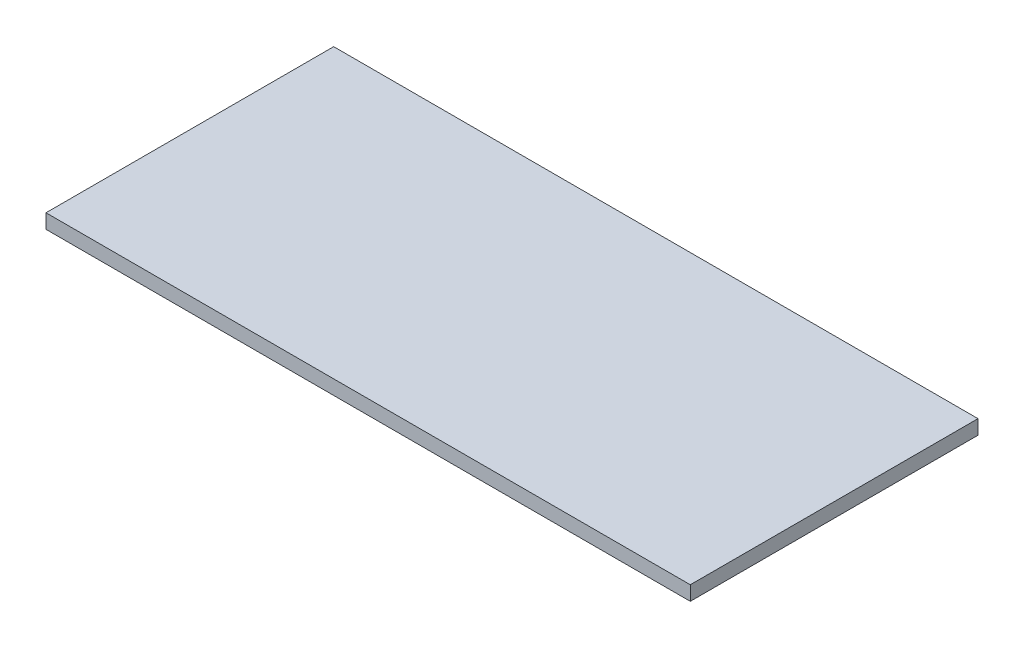
ISO-10303-21;
HEADER;
FILE_DESCRIPTION(('STEP AP214'),'2;1');
FILE_NAME('part.step','',(''),(''),'','','');
FILE_SCHEMA(('AUTOMOTIVE_DESIGN { 1 0 10303 214 1 1 1 1 }'));
ENDSEC;
DATA;
#1=APPLICATION_CONTEXT('core data for automotive mechanical design processes');
#2=APPLICATION_PROTOCOL_DEFINITION('international standard','automotive_design',2000,#1);
#3=PRODUCT_CONTEXT('',#1,'mechanical');
#4=PRODUCT('Part','Part','',(#3));
#5=PRODUCT_RELATED_PRODUCT_CATEGORY('part','',(#4));
#6=PRODUCT_DEFINITION_FORMATION('','',#4);
#7=PRODUCT_DEFINITION_CONTEXT('part definition',#1,'design');
#8=PRODUCT_DEFINITION('design','',#6,#7);
#9=PRODUCT_DEFINITION_SHAPE('','',#8);
#10=(LENGTH_UNIT() NAMED_UNIT(*) SI_UNIT(.MILLI.,.METRE.));
#11=(NAMED_UNIT(*) PLANE_ANGLE_UNIT() SI_UNIT($,.RADIAN.));
#12=(NAMED_UNIT(*) SI_UNIT($,.STERADIAN.) SOLID_ANGLE_UNIT());
#13=UNCERTAINTY_MEASURE_WITH_UNIT(LENGTH_MEASURE(1.E-05),#10,'distance_accuracy_value','');
#14=(GEOMETRIC_REPRESENTATION_CONTEXT(3) GLOBAL_UNCERTAINTY_ASSIGNED_CONTEXT((#13)) GLOBAL_UNIT_ASSIGNED_CONTEXT((#10,
#11,#12)) REPRESENTATION_CONTEXT('',''));
#15=CARTESIAN_POINT('',(0.,0.,0.));
#16=DIRECTION('',(0.,0.,1.));
#17=DIRECTION('',(1.,0.,0.));
#18=AXIS2_PLACEMENT_3D('',#15,#16,#17);
#19=CARTESIAN_POINT('',(-53.1131314392534,-2.54,50.8));
#20=DIRECTION('',(0.,1.,0.));
#21=DIRECTION('',(0.,0.,1.));
#22=AXIS2_PLACEMENT_3D('',#19,#20,#21);
#23=PLANE('',#22);
#24=DIRECTION('',(1.,0.,0.));
#25=VECTOR('',#24,1.);
#26=CARTESIAN_POINT('',(-53.1131314392534,-2.54,0.));
#27=LINE('',#26,#25);
#28=CARTESIAN_POINT('',(-53.1131314392534,-2.54,0.));
#29=VERTEX_POINT('',#28);
#30=CARTESIAN_POINT('',(60.6504377265333,-2.54,0.));
#31=VERTEX_POINT('',#30);
#32=EDGE_CURVE('E107',#29,#31,#27,.T.);
#33=ORIENTED_EDGE('',*,*,#32,.T.);
#34=DIRECTION('',(0.,0.,-1.));
#35=VECTOR('',#34,1.);
#36=CARTESIAN_POINT('',(60.6504377265333,-2.54,50.8));
#37=LINE('',#36,#35);
#38=CARTESIAN_POINT('',(60.6504377265333,-2.54,50.8));
#39=VERTEX_POINT('',#38);
#40=EDGE_CURVE('E11',#39,#31,#37,.T.);
#41=ORIENTED_EDGE('',*,*,#40,.F.);
#42=DIRECTION('',(1.,0.,0.));
#43=VECTOR('',#42,1.);
#44=CARTESIAN_POINT('',(-53.1131314392534,-2.54,50.8));
#45=LINE('',#44,#43);
#46=CARTESIAN_POINT('',(-53.1131314392534,-2.54,50.8));
#47=VERTEX_POINT('',#46);
#48=EDGE_CURVE('E80',#47,#39,#45,.T.);
#49=ORIENTED_EDGE('',*,*,#48,.F.);
#50=DIRECTION('',(0.,0.,-1.));
#51=VECTOR('',#50,1.);
#52=CARTESIAN_POINT('',(-53.1131314392534,-2.54,50.8));
#53=LINE('',#52,#51);
#54=EDGE_CURVE('E56',#47,#29,#53,.T.);
#55=ORIENTED_EDGE('',*,*,#54,.T.);
#56=EDGE_LOOP('',(#33,#41,#49,#55));
#57=FACE_BOUND('',#56,.T.);
#58=ADVANCED_FACE('F39',(#57),#23,.F.);
#59=CARTESIAN_POINT('',(60.6504377265333,0.,50.8));
#60=DIRECTION('',(1.,0.,0.));
#61=DIRECTION('',(0.,0.,-1.));
#62=AXIS2_PLACEMENT_3D('',#59,#60,#61);
#63=PLANE('',#62);
#64=DIRECTION('',(0.,-1.,0.));
#65=VECTOR('',#64,1.);
#66=CARTESIAN_POINT('',(60.6504377265333,0.,0.));
#67=LINE('',#66,#65);
#68=CARTESIAN_POINT('',(60.6504377265333,0.,0.));
#69=VERTEX_POINT('',#68);
#70=EDGE_CURVE('E89',#69,#31,#67,.T.);
#71=ORIENTED_EDGE('',*,*,#70,.F.);
#72=DIRECTION('',(0.,0.,-1.));
#73=VECTOR('',#72,1.);
#74=CARTESIAN_POINT('',(60.6504377265333,0.,50.8));
#75=LINE('',#74,#73);
#76=CARTESIAN_POINT('',(60.6504377265333,0.,50.8));
#77=VERTEX_POINT('',#76);
#78=EDGE_CURVE('E48',#77,#69,#75,.T.);
#79=ORIENTED_EDGE('',*,*,#78,.F.);
#80=DIRECTION('',(0.,-1.,0.));
#81=VECTOR('',#80,1.);
#82=CARTESIAN_POINT('',(60.6504377265333,0.,50.8));
#83=LINE('',#82,#81);
#84=EDGE_CURVE('E87',#77,#39,#83,.T.);
#85=ORIENTED_EDGE('',*,*,#84,.T.);
#86=ORIENTED_EDGE('',*,*,#40,.T.);
#87=EDGE_LOOP('',(#71,#79,#85,#86));
#88=FACE_BOUND('',#87,.T.);
#89=ADVANCED_FACE('F86',(#88),#63,.T.);
#90=CARTESIAN_POINT('',(-53.1131314392534,0.,50.8));
#91=DIRECTION('',(0.,1.,0.));
#92=DIRECTION('',(0.,0.,1.));
#93=AXIS2_PLACEMENT_3D('',#90,#91,#92);
#94=PLANE('',#93);
#95=DIRECTION('',(1.,0.,0.));
#96=VECTOR('',#95,1.);
#97=CARTESIAN_POINT('',(-53.1131314392534,0.,0.));
#98=LINE('',#97,#96);
#99=CARTESIAN_POINT('',(-53.1131314392534,0.,0.));
#100=VERTEX_POINT('',#99);
#101=EDGE_CURVE('E112',#100,#69,#98,.T.);
#102=ORIENTED_EDGE('',*,*,#101,.F.);
#103=DIRECTION('',(0.,0.,-1.));
#104=VECTOR('',#103,1.);
#105=CARTESIAN_POINT('',(-53.1131314392534,0.,50.8));
#106=LINE('',#105,#104);
#107=CARTESIAN_POINT('',(-53.1131314392534,0.,50.8));
#108=VERTEX_POINT('',#107);
#109=EDGE_CURVE('E69',#108,#100,#106,.T.);
#110=ORIENTED_EDGE('',*,*,#109,.F.);
#111=DIRECTION('',(1.,0.,0.));
#112=VECTOR('',#111,1.);
#113=CARTESIAN_POINT('',(-53.1131314392534,0.,50.8));
#114=LINE('',#113,#112);
#115=EDGE_CURVE('E96',#108,#77,#114,.T.);
#116=ORIENTED_EDGE('',*,*,#115,.T.);
#117=ORIENTED_EDGE('',*,*,#78,.T.);
#118=EDGE_LOOP('',(#102,#110,#116,#117));
#119=FACE_BOUND('',#118,.T.);
#120=ADVANCED_FACE('F99',(#119),#94,.T.);
#121=CARTESIAN_POINT('',(-53.1131314392534,-2.54,50.8));
#122=DIRECTION('',(-1.,0.,0.));
#123=DIRECTION('',(0.,0.,1.));
#124=AXIS2_PLACEMENT_3D('',#121,#122,#123);
#125=PLANE('',#124);
#126=DIRECTION('',(0.,1.,0.));
#127=VECTOR('',#126,1.);
#128=CARTESIAN_POINT('',(-53.1131314392534,-2.54,0.));
#129=LINE('',#128,#127);
#130=EDGE_CURVE('E115',#29,#100,#129,.T.);
#131=ORIENTED_EDGE('',*,*,#130,.F.);
#132=ORIENTED_EDGE('',*,*,#54,.F.);
#133=DIRECTION('',(0.,1.,0.));
#134=VECTOR('',#133,1.);
#135=CARTESIAN_POINT('',(-53.1131314392534,-2.54,50.8));
#136=LINE('',#135,#134);
#137=EDGE_CURVE('E101',#47,#108,#136,.T.);
#138=ORIENTED_EDGE('',*,*,#137,.T.);
#139=ORIENTED_EDGE('',*,*,#109,.T.);
#140=EDGE_LOOP('',(#131,#132,#138,#139));
#141=FACE_BOUND('',#140,.T.);
#142=ADVANCED_FACE('F125',(#141),#125,.T.);
#143=CARTESIAN_POINT('',(0.,0.,50.8));
#144=DIRECTION('',(0.,0.,-1.));
#145=DIRECTION('',(-1.,0.,0.));
#146=AXIS2_PLACEMENT_3D('',#143,#144,#145);
#147=PLANE('',#146);
#148=ORIENTED_EDGE('',*,*,#48,.T.);
#149=ORIENTED_EDGE('',*,*,#84,.F.);
#150=ORIENTED_EDGE('',*,*,#115,.F.);
#151=ORIENTED_EDGE('',*,*,#137,.F.);
#152=EDGE_LOOP('',(#148,#149,#150,#151));
#153=FACE_BOUND('',#152,.T.);
#154=ADVANCED_FACE('F95',(#153),#147,.F.);
#155=CARTESIAN_POINT('',(0.,0.,0.));
#156=DIRECTION('',(0.,0.,-1.));
#157=DIRECTION('',(-1.,0.,0.));
#158=AXIS2_PLACEMENT_3D('',#155,#156,#157);
#159=PLANE('',#158);
#160=ORIENTED_EDGE('',*,*,#32,.F.);
#161=ORIENTED_EDGE('',*,*,#130,.T.);
#162=ORIENTED_EDGE('',*,*,#101,.T.);
#163=ORIENTED_EDGE('',*,*,#70,.T.);
#164=EDGE_LOOP('',(#160,#161,#162,#163));
#165=FACE_BOUND('',#164,.T.);
#166=ADVANCED_FACE('F124',(#165),#159,.T.);
#167=CLOSED_SHELL('',(#58,#89,#120,#142,#154,#166));
#168=MANIFOLD_SOLID_BREP('B2',#167);
#169=ADVANCED_BREP_SHAPE_REPRESENTATION('',(#18,#168),#14);
#170=SHAPE_DEFINITION_REPRESENTATION(#9,#169);
ENDSEC;
END-ISO-10303-21;
